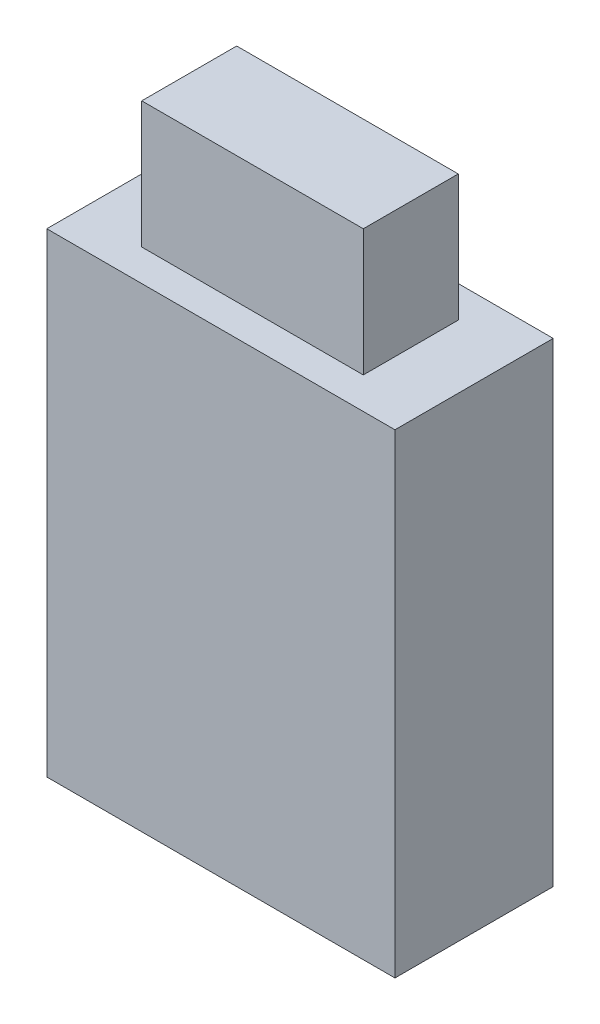
ISO-10303-21;
HEADER;
FILE_DESCRIPTION(('STEP AP214'),'2;1');
FILE_NAME('part.step','',(''),(''),'','','');
FILE_SCHEMA(('AUTOMOTIVE_DESIGN { 1 0 10303 214 1 1 1 1 }'));
ENDSEC;
DATA;
#1=APPLICATION_CONTEXT('core data for automotive mechanical design processes');
#2=APPLICATION_PROTOCOL_DEFINITION('international standard','automotive_design',2000,#1);
#3=PRODUCT_CONTEXT('',#1,'mechanical');
#4=PRODUCT('Part','Part','',(#3));
#5=PRODUCT_RELATED_PRODUCT_CATEGORY('part','',(#4));
#6=PRODUCT_DEFINITION_FORMATION('','',#4);
#7=PRODUCT_DEFINITION_CONTEXT('part definition',#1,'design');
#8=PRODUCT_DEFINITION('design','',#6,#7);
#9=PRODUCT_DEFINITION_SHAPE('','',#8);
#10=(LENGTH_UNIT() NAMED_UNIT(*) SI_UNIT(.MILLI.,.METRE.));
#11=(NAMED_UNIT(*) PLANE_ANGLE_UNIT() SI_UNIT($,.RADIAN.));
#12=(NAMED_UNIT(*) SI_UNIT($,.STERADIAN.) SOLID_ANGLE_UNIT());
#13=UNCERTAINTY_MEASURE_WITH_UNIT(LENGTH_MEASURE(1.E-05),#10,'distance_accuracy_value','');
#14=(GEOMETRIC_REPRESENTATION_CONTEXT(3) GLOBAL_UNCERTAINTY_ASSIGNED_CONTEXT((#13)) GLOBAL_UNIT_ASSIGNED_CONTEXT((#10,
#11,#12)) REPRESENTATION_CONTEXT('',''));
#15=CARTESIAN_POINT('',(0.,0.,0.));
#16=DIRECTION('',(0.,0.,1.));
#17=DIRECTION('',(1.,0.,0.));
#18=AXIS2_PLACEMENT_3D('',#15,#16,#17);
#19=CARTESIAN_POINT('',(-52.,158.,66.));
#20=DIRECTION('',(1.,0.,0.));
#21=DIRECTION('',(0.,0.,-1.));
#22=AXIS2_PLACEMENT_3D('',#19,#20,#21);
#23=PLANE('',#22);
#24=DIRECTION('',(0.,-1.,0.));
#25=VECTOR('',#24,1.);
#26=CARTESIAN_POINT('',(-52.,158.,56.));
#27=LINE('',#26,#25);
#28=CARTESIAN_POINT('',(-52.,188.,56.));
#29=VERTEX_POINT('',#28);
#30=CARTESIAN_POINT('',(-52.,158.,56.));
#31=VERTEX_POINT('',#30);
#32=EDGE_CURVE('E130',#29,#31,#27,.T.);
#33=ORIENTED_EDGE('',*,*,#32,.T.);
#34=DIRECTION('',(0.,0.,-1.));
#35=VECTOR('',#34,1.);
#36=CARTESIAN_POINT('',(-52.,158.,66.));
#37=LINE('',#36,#35);
#38=CARTESIAN_POINT('',(-52.,158.,66.));
#39=VERTEX_POINT('',#38);
#40=EDGE_CURVE('E11',#39,#31,#37,.T.);
#41=ORIENTED_EDGE('',*,*,#40,.F.);
#42=DIRECTION('',(0.,-1.,0.));
#43=VECTOR('',#42,1.);
#44=CARTESIAN_POINT('',(-52.,158.,66.));
#45=LINE('',#44,#43);
#46=CARTESIAN_POINT('',(-52.,188.,66.));
#47=VERTEX_POINT('',#46);
#48=EDGE_CURVE('E152',#47,#39,#45,.T.);
#49=ORIENTED_EDGE('',*,*,#48,.F.);
#50=DIRECTION('',(0.,0.,-1.));
#51=VECTOR('',#50,1.);
#52=CARTESIAN_POINT('',(-52.,188.,66.));
#53=LINE('',#52,#51);
#54=EDGE_CURVE('E158',#47,#29,#53,.T.);
#55=ORIENTED_EDGE('',*,*,#54,.T.);
#56=EDGE_LOOP('',(#33,#41,#49,#55));
#57=FACE_BOUND('',#56,.T.);
#58=ADVANCED_FACE('F41',(#57),#23,.F.);
#59=CARTESIAN_POINT('',(-52.,158.,66.));
#60=DIRECTION('',(0.,1.,0.));
#61=DIRECTION('',(0.,0.,1.));
#62=AXIS2_PLACEMENT_3D('',#59,#60,#61);
#63=PLANE('',#62);
#64=DIRECTION('',(1.,0.,0.));
#65=VECTOR('',#64,1.);
#66=CARTESIAN_POINT('',(-52.,158.,56.));
#67=LINE('',#66,#65);
#68=CARTESIAN_POINT('',(-30.,158.,56.));
#69=VERTEX_POINT('',#68);
#70=EDGE_CURVE('E161',#31,#69,#67,.T.);
#71=ORIENTED_EDGE('',*,*,#70,.T.);
#72=DIRECTION('',(0.,0.,-1.));
#73=VECTOR('',#72,1.);
#74=CARTESIAN_POINT('',(-30.,158.,66.));
#75=LINE('',#74,#73);
#76=CARTESIAN_POINT('',(-30.,158.,66.));
#77=VERTEX_POINT('',#76);
#78=EDGE_CURVE('E48',#77,#69,#75,.T.);
#79=ORIENTED_EDGE('',*,*,#78,.F.);
#80=DIRECTION('',(1.,0.,0.));
#81=VECTOR('',#80,1.);
#82=CARTESIAN_POINT('',(-52.,158.,66.));
#83=LINE('',#82,#81);
#84=EDGE_CURVE('E92',#39,#77,#83,.T.);
#85=ORIENTED_EDGE('',*,*,#84,.F.);
#86=ORIENTED_EDGE('',*,*,#40,.T.);
#87=EDGE_LOOP('',(#71,#79,#85,#86));
#88=FACE_BOUND('',#87,.T.);
#89=ADVANCED_FACE('F190',(#88),#63,.F.);
#90=CARTESIAN_POINT('',(-30.,158.,66.));
#91=DIRECTION('',(-1.,0.,0.));
#92=DIRECTION('',(0.,0.,1.));
#93=AXIS2_PLACEMENT_3D('',#90,#91,#92);
#94=PLANE('',#93);
#95=DIRECTION('',(0.,1.,0.));
#96=VECTOR('',#95,1.);
#97=CARTESIAN_POINT('',(-30.,158.,56.));
#98=LINE('',#97,#96);
#99=CARTESIAN_POINT('',(-30.,188.,56.));
#100=VERTEX_POINT('',#99);
#101=EDGE_CURVE('E163',#69,#100,#98,.T.);
#102=ORIENTED_EDGE('',*,*,#101,.T.);
#103=DIRECTION('',(0.,0.,-1.));
#104=VECTOR('',#103,1.);
#105=CARTESIAN_POINT('',(-30.,188.,66.));
#106=LINE('',#105,#104);
#107=CARTESIAN_POINT('',(-30.,188.,66.));
#108=VERTEX_POINT('',#107);
#109=EDGE_CURVE('E167',#108,#100,#106,.T.);
#110=ORIENTED_EDGE('',*,*,#109,.F.);
#111=DIRECTION('',(0.,1.,0.));
#112=VECTOR('',#111,1.);
#113=CARTESIAN_POINT('',(-30.,158.,66.));
#114=LINE('',#113,#112);
#115=EDGE_CURVE('E155',#77,#108,#114,.T.);
#116=ORIENTED_EDGE('',*,*,#115,.F.);
#117=ORIENTED_EDGE('',*,*,#78,.T.);
#118=EDGE_LOOP('',(#102,#110,#116,#117));
#119=FACE_BOUND('',#118,.T.);
#120=ADVANCED_FACE('F172',(#119),#94,.F.);
#121=CARTESIAN_POINT('',(-52.,188.,66.));
#122=DIRECTION('',(0.,-1.,0.));
#123=DIRECTION('',(0.,0.,-1.));
#124=AXIS2_PLACEMENT_3D('',#121,#122,#123);
#125=PLANE('',#124);
#126=DIRECTION('',(0.,0.,-1.));
#127=VECTOR('',#126,1.);
#128=CARTESIAN_POINT('',(-48.,188.,64.));
#129=LINE('',#128,#127);
#130=CARTESIAN_POINT('',(-48.,188.,64.));
#131=VERTEX_POINT('',#130);
#132=CARTESIAN_POINT('',(-48.,188.,58.));
#133=VERTEX_POINT('',#132);
#134=EDGE_CURVE('E126',#131,#133,#129,.T.);
#135=ORIENTED_EDGE('',*,*,#134,.T.);
#136=DIRECTION('',(1.,0.,0.));
#137=VECTOR('',#136,1.);
#138=CARTESIAN_POINT('',(-48.,188.,58.));
#139=LINE('',#138,#137);
#140=CARTESIAN_POINT('',(-34.,188.,58.));
#141=VERTEX_POINT('',#140);
#142=EDGE_CURVE('E142',#133,#141,#139,.T.);
#143=ORIENTED_EDGE('',*,*,#142,.T.);
#144=DIRECTION('',(0.,0.,-1.));
#145=VECTOR('',#144,1.);
#146=CARTESIAN_POINT('',(-34.,188.,64.));
#147=LINE('',#146,#145);
#148=CARTESIAN_POINT('',(-34.,188.,64.));
#149=VERTEX_POINT('',#148);
#150=EDGE_CURVE('E131',#149,#141,#147,.T.);
#151=ORIENTED_EDGE('',*,*,#150,.F.);
#152=DIRECTION('',(1.,0.,0.));
#153=VECTOR('',#152,1.);
#154=CARTESIAN_POINT('',(-48.,188.,64.));
#155=LINE('',#154,#153);
#156=EDGE_CURVE('E118',#131,#149,#155,.T.);
#157=ORIENTED_EDGE('',*,*,#156,.F.);
#158=EDGE_LOOP('',(#135,#143,#151,#157));
#159=FACE_BOUND('',#158,.T.);
#160=DIRECTION('',(-1.,0.,0.));
#161=VECTOR('',#160,1.);
#162=CARTESIAN_POINT('',(-52.,188.,56.));
#163=LINE('',#162,#161);
#164=EDGE_CURVE('E85',#100,#29,#163,.T.);
#165=ORIENTED_EDGE('',*,*,#164,.T.);
#166=ORIENTED_EDGE('',*,*,#54,.F.);
#167=DIRECTION('',(-1.,0.,0.));
#168=VECTOR('',#167,1.);
#169=CARTESIAN_POINT('',(-52.,188.,66.));
#170=LINE('',#169,#168);
#171=EDGE_CURVE('E64',#108,#47,#170,.T.);
#172=ORIENTED_EDGE('',*,*,#171,.F.);
#173=ORIENTED_EDGE('',*,*,#109,.T.);
#174=EDGE_LOOP('',(#165,#166,#172,#173));
#175=FACE_BOUND('',#174,.T.);
#176=ADVANCED_FACE('F134',(#159,#175),#125,.F.);
#177=CARTESIAN_POINT('',(0.,0.,66.));
#178=DIRECTION('',(0.,0.,-1.));
#179=DIRECTION('',(-1.,0.,0.));
#180=AXIS2_PLACEMENT_3D('',#177,#178,#179);
#181=PLANE('',#180);
#182=ORIENTED_EDGE('',*,*,#48,.T.);
#183=ORIENTED_EDGE('',*,*,#84,.T.);
#184=ORIENTED_EDGE('',*,*,#115,.T.);
#185=ORIENTED_EDGE('',*,*,#171,.T.);
#186=EDGE_LOOP('',(#182,#183,#184,#185));
#187=FACE_BOUND('',#186,.T.);
#188=ADVANCED_FACE('F181',(#187),#181,.F.);
#189=CARTESIAN_POINT('',(0.,0.,56.));
#190=DIRECTION('',(0.,0.,-1.));
#191=DIRECTION('',(-1.,0.,0.));
#192=AXIS2_PLACEMENT_3D('',#189,#190,#191);
#193=PLANE('',#192);
#194=ORIENTED_EDGE('',*,*,#32,.F.);
#195=ORIENTED_EDGE('',*,*,#164,.F.);
#196=ORIENTED_EDGE('',*,*,#101,.F.);
#197=ORIENTED_EDGE('',*,*,#70,.F.);
#198=EDGE_LOOP('',(#194,#195,#196,#197));
#199=FACE_BOUND('',#198,.T.);
#200=ADVANCED_FACE('F176',(#199),#193,.T.);
#201=CARTESIAN_POINT('',(-48.,188.,64.));
#202=DIRECTION('',(1.,0.,0.));
#203=DIRECTION('',(0.,0.,-1.));
#204=AXIS2_PLACEMENT_3D('',#201,#202,#203);
#205=PLANE('',#204);
#206=DIRECTION('',(0.,-1.,0.));
#207=VECTOR('',#206,1.);
#208=CARTESIAN_POINT('',(-48.,188.,58.));
#209=LINE('',#208,#207);
#210=CARTESIAN_POINT('',(-48.,196.,58.));
#211=VERTEX_POINT('',#210);
#212=EDGE_CURVE('E55',#211,#133,#209,.T.);
#213=ORIENTED_EDGE('',*,*,#212,.T.);
#214=ORIENTED_EDGE('',*,*,#134,.F.);
#215=DIRECTION('',(0.,-1.,0.));
#216=VECTOR('',#215,1.);
#217=CARTESIAN_POINT('',(-48.,188.,64.));
#218=LINE('',#217,#216);
#219=CARTESIAN_POINT('',(-48.,196.,64.));
#220=VERTEX_POINT('',#219);
#221=EDGE_CURVE('E115',#220,#131,#218,.T.);
#222=ORIENTED_EDGE('',*,*,#221,.F.);
#223=DIRECTION('',(0.,0.,-1.));
#224=VECTOR('',#223,1.);
#225=CARTESIAN_POINT('',(-48.,196.,64.));
#226=LINE('',#225,#224);
#227=EDGE_CURVE('E140',#220,#211,#226,.T.);
#228=ORIENTED_EDGE('',*,*,#227,.T.);
#229=EDGE_LOOP('',(#213,#214,#222,#228));
#230=FACE_BOUND('',#229,.T.);
#231=ADVANCED_FACE('F127',(#230),#205,.F.);
#232=CARTESIAN_POINT('',(-34.,188.,64.));
#233=DIRECTION('',(-1.,0.,0.));
#234=DIRECTION('',(0.,0.,1.));
#235=AXIS2_PLACEMENT_3D('',#232,#233,#234);
#236=PLANE('',#235);
#237=DIRECTION('',(0.,1.,0.));
#238=VECTOR('',#237,1.);
#239=CARTESIAN_POINT('',(-34.,188.,58.));
#240=LINE('',#239,#238);
#241=CARTESIAN_POINT('',(-34.,196.,58.));
#242=VERTEX_POINT('',#241);
#243=EDGE_CURVE('E144',#141,#242,#240,.T.);
#244=ORIENTED_EDGE('',*,*,#243,.T.);
#245=DIRECTION('',(0.,0.,-1.));
#246=VECTOR('',#245,1.);
#247=CARTESIAN_POINT('',(-34.,196.,64.));
#248=LINE('',#247,#246);
#249=CARTESIAN_POINT('',(-34.,196.,64.));
#250=VERTEX_POINT('',#249);
#251=EDGE_CURVE('E148',#250,#242,#248,.T.);
#252=ORIENTED_EDGE('',*,*,#251,.F.);
#253=DIRECTION('',(0.,1.,0.));
#254=VECTOR('',#253,1.);
#255=CARTESIAN_POINT('',(-34.,188.,64.));
#256=LINE('',#255,#254);
#257=EDGE_CURVE('E135',#149,#250,#256,.T.);
#258=ORIENTED_EDGE('',*,*,#257,.F.);
#259=ORIENTED_EDGE('',*,*,#150,.T.);
#260=EDGE_LOOP('',(#244,#252,#258,#259));
#261=FACE_BOUND('',#260,.T.);
#262=ADVANCED_FACE('F223',(#261),#236,.F.);
#263=CARTESIAN_POINT('',(-48.,196.,64.));
#264=DIRECTION('',(0.,-1.,0.));
#265=DIRECTION('',(0.,0.,-1.));
#266=AXIS2_PLACEMENT_3D('',#263,#264,#265);
#267=PLANE('',#266);
#268=DIRECTION('',(-1.,0.,0.));
#269=VECTOR('',#268,1.);
#270=CARTESIAN_POINT('',(-48.,196.,58.));
#271=LINE('',#270,#269);
#272=EDGE_CURVE('E123',#242,#211,#271,.T.);
#273=ORIENTED_EDGE('',*,*,#272,.T.);
#274=ORIENTED_EDGE('',*,*,#227,.F.);
#275=DIRECTION('',(-1.,0.,0.));
#276=VECTOR('',#275,1.);
#277=CARTESIAN_POINT('',(-48.,196.,64.));
#278=LINE('',#277,#276);
#279=EDGE_CURVE('E121',#250,#220,#278,.T.);
#280=ORIENTED_EDGE('',*,*,#279,.F.);
#281=ORIENTED_EDGE('',*,*,#251,.T.);
#282=EDGE_LOOP('',(#273,#274,#280,#281));
#283=FACE_BOUND('',#282,.T.);
#284=ADVANCED_FACE('F232',(#283),#267,.F.);
#285=CARTESIAN_POINT('',(0.,0.,64.));
#286=DIRECTION('',(0.,0.,-1.));
#287=DIRECTION('',(-1.,0.,0.));
#288=AXIS2_PLACEMENT_3D('',#285,#286,#287);
#289=PLANE('',#288);
#290=ORIENTED_EDGE('',*,*,#221,.T.);
#291=ORIENTED_EDGE('',*,*,#156,.T.);
#292=ORIENTED_EDGE('',*,*,#257,.T.);
#293=ORIENTED_EDGE('',*,*,#279,.T.);
#294=EDGE_LOOP('',(#290,#291,#292,#293));
#295=FACE_BOUND('',#294,.T.);
#296=ADVANCED_FACE('F116',(#295),#289,.F.);
#297=CARTESIAN_POINT('',(0.,0.,58.));
#298=DIRECTION('',(0.,0.,-1.));
#299=DIRECTION('',(-1.,0.,0.));
#300=AXIS2_PLACEMENT_3D('',#297,#298,#299);
#301=PLANE('',#300);
#302=ORIENTED_EDGE('',*,*,#212,.F.);
#303=ORIENTED_EDGE('',*,*,#272,.F.);
#304=ORIENTED_EDGE('',*,*,#243,.F.);
#305=ORIENTED_EDGE('',*,*,#142,.F.);
#306=EDGE_LOOP('',(#302,#303,#304,#305));
#307=FACE_BOUND('',#306,.T.);
#308=ADVANCED_FACE('F251',(#307),#301,.T.);
#309=CLOSED_SHELL('',(#58,#89,#120,#176,#188,#200,#231,#262,#284,#296,#308));
#310=MANIFOLD_SOLID_BREP('B2',#309);
#311=ADVANCED_BREP_SHAPE_REPRESENTATION('',(#18,#310),#14);
#312=SHAPE_DEFINITION_REPRESENTATION(#9,#311);
ENDSEC;
END-ISO-10303-21;
